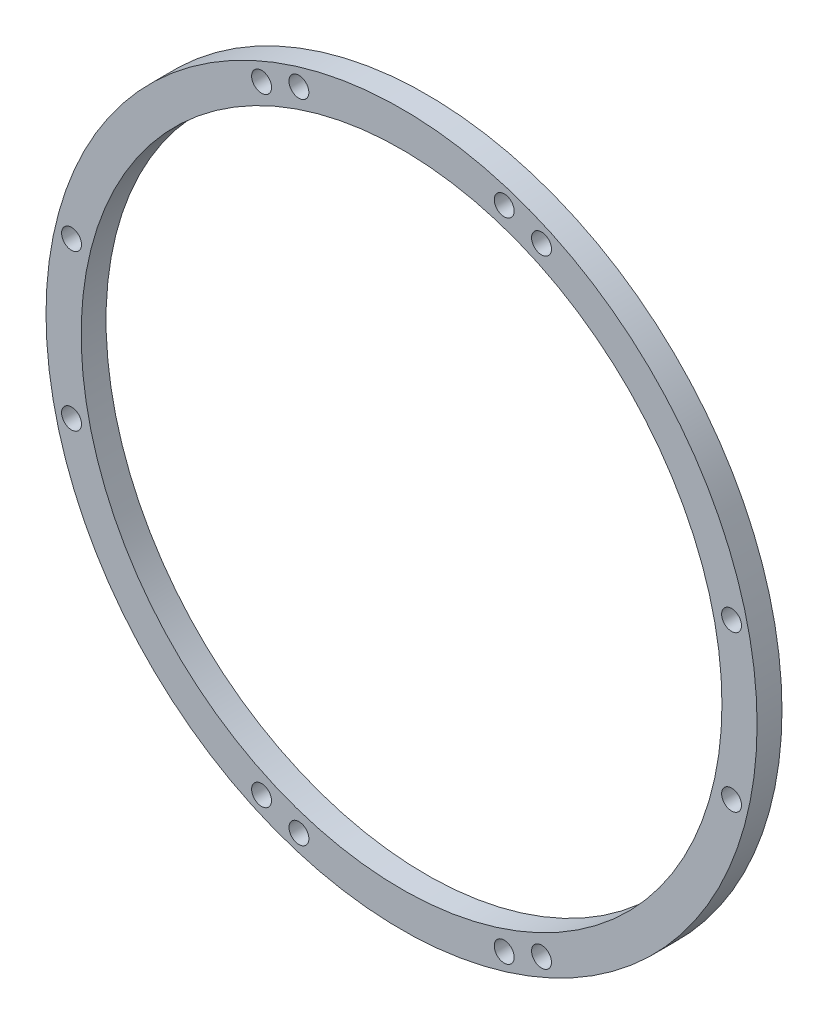
ISO-10303-21;
HEADER;
FILE_DESCRIPTION(('STEP AP214'),'2;1');
FILE_NAME('part.step','',(''),(''),'','','');
FILE_SCHEMA(('AUTOMOTIVE_DESIGN { 1 0 10303 214 1 1 1 1 }'));
ENDSEC;
DATA;
#1=APPLICATION_CONTEXT('core data for automotive mechanical design processes');
#2=APPLICATION_PROTOCOL_DEFINITION('international standard','automotive_design',2000,#1);
#3=PRODUCT_CONTEXT('',#1,'mechanical');
#4=PRODUCT('Part','Part','',(#3));
#5=PRODUCT_RELATED_PRODUCT_CATEGORY('part','',(#4));
#6=PRODUCT_DEFINITION_FORMATION('','',#4);
#7=PRODUCT_DEFINITION_CONTEXT('part definition',#1,'design');
#8=PRODUCT_DEFINITION('design','',#6,#7);
#9=PRODUCT_DEFINITION_SHAPE('','',#8);
#10=(LENGTH_UNIT() NAMED_UNIT(*) SI_UNIT(.MILLI.,.METRE.));
#11=(NAMED_UNIT(*) PLANE_ANGLE_UNIT() SI_UNIT($,.RADIAN.));
#12=(NAMED_UNIT(*) SI_UNIT($,.STERADIAN.) SOLID_ANGLE_UNIT());
#13=UNCERTAINTY_MEASURE_WITH_UNIT(LENGTH_MEASURE(1.E-05),#10,'distance_accuracy_value','');
#14=(GEOMETRIC_REPRESENTATION_CONTEXT(3) GLOBAL_UNCERTAINTY_ASSIGNED_CONTEXT((#13)) GLOBAL_UNIT_ASSIGNED_CONTEXT((#10,
#11,#12)) REPRESENTATION_CONTEXT('',''));
#15=CARTESIAN_POINT('',(0.,0.,0.));
#16=DIRECTION('',(0.,0.,1.));
#17=DIRECTION('',(1.,0.,0.));
#18=AXIS2_PLACEMENT_3D('',#15,#16,#17);
#19=CARTESIAN_POINT('',(0.,0.,4.));
#20=DIRECTION('',(0.,0.,1.));
#21=DIRECTION('',(1.,0.,0.));
#22=AXIS2_PLACEMENT_3D('',#19,#20,#21);
#23=PLANE('',#22);
#24=CARTESIAN_POINT('',(-22.5,49.6386945839634,4.));
#25=DIRECTION('',(0.,0.,1.));
#26=DIRECTION('',(-1.,0.,0.));
#27=AXIS2_PLACEMENT_3D('',#24,#25,#26);
#28=CIRCLE('',#27,1.6);
#29=CARTESIAN_POINT('',(-24.1,49.6386945839634,4.));
#30=VERTEX_POINT('',#29);
#31=EDGE_CURVE('E113',#30,#30,#28,.T.);
#32=ORIENTED_EDGE('',*,*,#31,.F.);
#33=EDGE_LOOP('',(#32));
#34=FACE_BOUND('',#33,.T.);
#35=CARTESIAN_POINT('',(-53.0471488394994,-12.5,4.));
#36=DIRECTION('',(0.,0.,1.));
#37=DIRECTION('',(1.,0.,0.));
#38=AXIS2_PLACEMENT_3D('',#35,#36,#37);
#39=CIRCLE('',#38,1.6);
#40=CARTESIAN_POINT('',(-51.4471488394994,-12.5,4.));
#41=VERTEX_POINT('',#40);
#42=EDGE_CURVE('E101',#41,#41,#39,.T.);
#43=ORIENTED_EDGE('',*,*,#42,.F.);
#44=EDGE_LOOP('',(#43));
#45=FACE_BOUND('',#44,.T.);
#46=CARTESIAN_POINT('',(-16.5,-51.9422756528822,4.));
#47=DIRECTION('',(0.,0.,1.));
#48=DIRECTION('',(1.,0.,0.));
#49=AXIS2_PLACEMENT_3D('',#46,#47,#48);
#50=CIRCLE('',#49,1.6);
#51=CARTESIAN_POINT('',(-14.9,-51.9422756528822,4.));
#52=VERTEX_POINT('',#51);
#53=EDGE_CURVE('E89',#52,#52,#50,.T.);
#54=ORIENTED_EDGE('',*,*,#53,.F.);
#55=EDGE_LOOP('',(#54));
#56=FACE_BOUND('',#55,.T.);
#57=CARTESIAN_POINT('',(16.5,-51.9422756528822,4.));
#58=DIRECTION('',(0.,0.,1.));
#59=DIRECTION('',(-1.,0.,0.));
#60=AXIS2_PLACEMENT_3D('',#57,#58,#59);
#61=CIRCLE('',#60,1.6);
#62=CARTESIAN_POINT('',(14.9,-51.9422756528822,4.));
#63=VERTEX_POINT('',#62);
#64=EDGE_CURVE('E77',#63,#63,#61,.T.);
#65=ORIENTED_EDGE('',*,*,#64,.F.);
#66=EDGE_LOOP('',(#65));
#67=FACE_BOUND('',#66,.T.);
#68=CARTESIAN_POINT('',(53.0471488394994,12.5,4.));
#69=DIRECTION('',(0.,0.,1.));
#70=DIRECTION('',(1.,0.,0.));
#71=AXIS2_PLACEMENT_3D('',#68,#69,#70);
#72=CIRCLE('',#71,1.6);
#73=CARTESIAN_POINT('',(54.6471488394994,12.5,4.));
#74=VERTEX_POINT('',#73);
#75=EDGE_CURVE('E65',#74,#74,#72,.T.);
#76=ORIENTED_EDGE('',*,*,#75,.F.);
#77=EDGE_LOOP('',(#76));
#78=FACE_BOUND('',#77,.T.);
#79=CARTESIAN_POINT('',(16.5,51.9422756528822,4.));
#80=DIRECTION('',(0.,0.,1.));
#81=DIRECTION('',(1.,0.,0.));
#82=AXIS2_PLACEMENT_3D('',#79,#80,#81);
#83=CIRCLE('',#82,1.6);
#84=CARTESIAN_POINT('',(18.1,51.9422756528822,4.));
#85=VERTEX_POINT('',#84);
#86=EDGE_CURVE('E53',#85,#85,#83,.T.);
#87=ORIENTED_EDGE('',*,*,#86,.F.);
#88=EDGE_LOOP('',(#87));
#89=FACE_BOUND('',#88,.T.);
#90=CARTESIAN_POINT('',(0.,0.,4.));
#91=DIRECTION('',(0.,0.,1.));
#92=DIRECTION('',(1.,0.,0.));
#93=AXIS2_PLACEMENT_3D('',#90,#91,#92);
#94=CIRCLE('',#93,57.15);
#95=CARTESIAN_POINT('',(57.15,0.,4.));
#96=VERTEX_POINT('',#95);
#97=EDGE_CURVE('E10',#96,#96,#94,.T.);
#98=ORIENTED_EDGE('',*,*,#97,.T.);
#99=EDGE_LOOP('',(#98));
#100=FACE_BOUND('',#99,.T.);
#101=CARTESIAN_POINT('',(0.,0.,4.));
#102=DIRECTION('',(0.,0.,1.));
#103=DIRECTION('',(1.,0.,0.));
#104=AXIS2_PLACEMENT_3D('',#101,#102,#103);
#105=CIRCLE('',#104,51.5);
#106=CARTESIAN_POINT('',(51.5,0.,4.));
#107=VERTEX_POINT('',#106);
#108=EDGE_CURVE('E48',#107,#107,#105,.T.);
#109=ORIENTED_EDGE('',*,*,#108,.F.);
#110=EDGE_LOOP('',(#109));
#111=FACE_BOUND('',#110,.T.);
#112=CARTESIAN_POINT('',(22.5,49.6386945839634,4.));
#113=DIRECTION('',(0.,0.,1.));
#114=DIRECTION('',(1.,0.,0.));
#115=AXIS2_PLACEMENT_3D('',#112,#113,#114);
#116=CIRCLE('',#115,1.6);
#117=CARTESIAN_POINT('',(24.1,49.6386945839634,4.));
#118=VERTEX_POINT('',#117);
#119=EDGE_CURVE('E59',#118,#118,#116,.T.);
#120=ORIENTED_EDGE('',*,*,#119,.F.);
#121=EDGE_LOOP('',(#120));
#122=FACE_BOUND('',#121,.T.);
#123=CARTESIAN_POINT('',(22.5,-49.6386945839634,4.));
#124=DIRECTION('',(0.,0.,1.));
#125=DIRECTION('',(-1.,0.,0.));
#126=AXIS2_PLACEMENT_3D('',#123,#124,#125);
#127=CIRCLE('',#126,1.6);
#128=CARTESIAN_POINT('',(20.9,-49.6386945839634,4.));
#129=VERTEX_POINT('',#128);
#130=EDGE_CURVE('E71',#129,#129,#127,.T.);
#131=ORIENTED_EDGE('',*,*,#130,.F.);
#132=EDGE_LOOP('',(#131));
#133=FACE_BOUND('',#132,.T.);
#134=CARTESIAN_POINT('',(53.0471488394994,-12.5,4.));
#135=DIRECTION('',(0.,0.,1.));
#136=DIRECTION('',(-1.,0.,0.));
#137=AXIS2_PLACEMENT_3D('',#134,#135,#136);
#138=CIRCLE('',#137,1.6);
#139=CARTESIAN_POINT('',(51.4471488394994,-12.5,4.));
#140=VERTEX_POINT('',#139);
#141=EDGE_CURVE('E83',#140,#140,#138,.T.);
#142=ORIENTED_EDGE('',*,*,#141,.F.);
#143=EDGE_LOOP('',(#142));
#144=FACE_BOUND('',#143,.T.);
#145=CARTESIAN_POINT('',(-22.5,-49.6386945839634,4.));
#146=DIRECTION('',(0.,0.,1.));
#147=DIRECTION('',(1.,0.,0.));
#148=AXIS2_PLACEMENT_3D('',#145,#146,#147);
#149=CIRCLE('',#148,1.6);
#150=CARTESIAN_POINT('',(-20.9,-49.6386945839634,4.));
#151=VERTEX_POINT('',#150);
#152=EDGE_CURVE('E95',#151,#151,#149,.T.);
#153=ORIENTED_EDGE('',*,*,#152,.F.);
#154=EDGE_LOOP('',(#153));
#155=FACE_BOUND('',#154,.T.);
#156=CARTESIAN_POINT('',(-53.0471488394994,12.5,4.));
#157=DIRECTION('',(0.,0.,1.));
#158=DIRECTION('',(-1.,0.,0.));
#159=AXIS2_PLACEMENT_3D('',#156,#157,#158);
#160=CIRCLE('',#159,1.6);
#161=CARTESIAN_POINT('',(-54.6471488394994,12.5,4.));
#162=VERTEX_POINT('',#161);
#163=EDGE_CURVE('E107',#162,#162,#160,.T.);
#164=ORIENTED_EDGE('',*,*,#163,.F.);
#165=EDGE_LOOP('',(#164));
#166=FACE_BOUND('',#165,.T.);
#167=CARTESIAN_POINT('',(-16.5,51.9422756528822,4.));
#168=DIRECTION('',(0.,0.,1.));
#169=DIRECTION('',(-1.,0.,0.));
#170=AXIS2_PLACEMENT_3D('',#167,#168,#169);
#171=CIRCLE('',#170,1.6);
#172=CARTESIAN_POINT('',(-18.1,51.9422756528822,4.));
#173=VERTEX_POINT('',#172);
#174=EDGE_CURVE('E119',#173,#173,#171,.T.);
#175=ORIENTED_EDGE('',*,*,#174,.F.);
#176=EDGE_LOOP('',(#175));
#177=FACE_BOUND('',#176,.T.);
#178=ADVANCED_FACE('F37',(#34,#45,#56,#67,#78,#89,#100,#111,#122,#133,#144,#155,#166,#177),#23,.T.);
#179=CARTESIAN_POINT('',(0.,0.,0.));
#180=DIRECTION('',(0.,0.,1.));
#181=DIRECTION('',(1.,0.,0.));
#182=AXIS2_PLACEMENT_3D('',#179,#180,#181);
#183=PLANE('',#182);
#184=CARTESIAN_POINT('',(0.,0.,0.));
#185=DIRECTION('',(0.,0.,1.));
#186=DIRECTION('',(1.,0.,0.));
#187=AXIS2_PLACEMENT_3D('',#184,#185,#186);
#188=CIRCLE('',#187,57.15);
#189=CARTESIAN_POINT('',(57.15,0.,0.));
#190=VERTEX_POINT('',#189);
#191=EDGE_CURVE('E41',#190,#190,#188,.T.);
#192=ORIENTED_EDGE('',*,*,#191,.F.);
#193=EDGE_LOOP('',(#192));
#194=FACE_BOUND('',#193,.T.);
#195=CARTESIAN_POINT('',(0.,0.,0.));
#196=DIRECTION('',(0.,0.,1.));
#197=DIRECTION('',(1.,0.,0.));
#198=AXIS2_PLACEMENT_3D('',#195,#196,#197);
#199=CIRCLE('',#198,51.5);
#200=CARTESIAN_POINT('',(51.5,0.,0.));
#201=VERTEX_POINT('',#200);
#202=EDGE_CURVE('E50',#201,#201,#199,.T.);
#203=ORIENTED_EDGE('',*,*,#202,.T.);
#204=EDGE_LOOP('',(#203));
#205=FACE_BOUND('',#204,.T.);
#206=CARTESIAN_POINT('',(16.5,51.9422756528822,0.));
#207=DIRECTION('',(0.,0.,1.));
#208=DIRECTION('',(1.,0.,0.));
#209=AXIS2_PLACEMENT_3D('',#206,#207,#208);
#210=CIRCLE('',#209,1.6);
#211=CARTESIAN_POINT('',(18.1,51.9422756528822,0.));
#212=VERTEX_POINT('',#211);
#213=EDGE_CURVE('E56',#212,#212,#210,.T.);
#214=ORIENTED_EDGE('',*,*,#213,.T.);
#215=EDGE_LOOP('',(#214));
#216=FACE_BOUND('',#215,.T.);
#217=CARTESIAN_POINT('',(22.5,49.6386945839634,0.));
#218=DIRECTION('',(0.,0.,1.));
#219=DIRECTION('',(1.,0.,0.));
#220=AXIS2_PLACEMENT_3D('',#217,#218,#219);
#221=CIRCLE('',#220,1.6);
#222=CARTESIAN_POINT('',(24.1,49.6386945839634,0.));
#223=VERTEX_POINT('',#222);
#224=EDGE_CURVE('E62',#223,#223,#221,.T.);
#225=ORIENTED_EDGE('',*,*,#224,.T.);
#226=EDGE_LOOP('',(#225));
#227=FACE_BOUND('',#226,.T.);
#228=CARTESIAN_POINT('',(53.0471488394994,12.5,0.));
#229=DIRECTION('',(0.,0.,1.));
#230=DIRECTION('',(1.,0.,0.));
#231=AXIS2_PLACEMENT_3D('',#228,#229,#230);
#232=CIRCLE('',#231,1.6);
#233=CARTESIAN_POINT('',(54.6471488394994,12.5,0.));
#234=VERTEX_POINT('',#233);
#235=EDGE_CURVE('E68',#234,#234,#232,.T.);
#236=ORIENTED_EDGE('',*,*,#235,.T.);
#237=EDGE_LOOP('',(#236));
#238=FACE_BOUND('',#237,.T.);
#239=CARTESIAN_POINT('',(22.5,-49.6386945839634,0.));
#240=DIRECTION('',(0.,0.,1.));
#241=DIRECTION('',(-1.,0.,0.));
#242=AXIS2_PLACEMENT_3D('',#239,#240,#241);
#243=CIRCLE('',#242,1.6);
#244=CARTESIAN_POINT('',(20.9,-49.6386945839634,0.));
#245=VERTEX_POINT('',#244);
#246=EDGE_CURVE('E74',#245,#245,#243,.T.);
#247=ORIENTED_EDGE('',*,*,#246,.T.);
#248=EDGE_LOOP('',(#247));
#249=FACE_BOUND('',#248,.T.);
#250=CARTESIAN_POINT('',(16.5,-51.9422756528822,0.));
#251=DIRECTION('',(0.,0.,1.));
#252=DIRECTION('',(-1.,0.,0.));
#253=AXIS2_PLACEMENT_3D('',#250,#251,#252);
#254=CIRCLE('',#253,1.6);
#255=CARTESIAN_POINT('',(14.9,-51.9422756528822,0.));
#256=VERTEX_POINT('',#255);
#257=EDGE_CURVE('E80',#256,#256,#254,.T.);
#258=ORIENTED_EDGE('',*,*,#257,.T.);
#259=EDGE_LOOP('',(#258));
#260=FACE_BOUND('',#259,.T.);
#261=CARTESIAN_POINT('',(53.0471488394994,-12.5,0.));
#262=DIRECTION('',(0.,0.,1.));
#263=DIRECTION('',(-1.,0.,0.));
#264=AXIS2_PLACEMENT_3D('',#261,#262,#263);
#265=CIRCLE('',#264,1.6);
#266=CARTESIAN_POINT('',(51.4471488394994,-12.5,0.));
#267=VERTEX_POINT('',#266);
#268=EDGE_CURVE('E86',#267,#267,#265,.T.);
#269=ORIENTED_EDGE('',*,*,#268,.T.);
#270=EDGE_LOOP('',(#269));
#271=FACE_BOUND('',#270,.T.);
#272=CARTESIAN_POINT('',(-16.5,-51.9422756528822,0.));
#273=DIRECTION('',(0.,0.,1.));
#274=DIRECTION('',(1.,0.,0.));
#275=AXIS2_PLACEMENT_3D('',#272,#273,#274);
#276=CIRCLE('',#275,1.6);
#277=CARTESIAN_POINT('',(-14.9,-51.9422756528822,0.));
#278=VERTEX_POINT('',#277);
#279=EDGE_CURVE('E92',#278,#278,#276,.T.);
#280=ORIENTED_EDGE('',*,*,#279,.T.);
#281=EDGE_LOOP('',(#280));
#282=FACE_BOUND('',#281,.T.);
#283=CARTESIAN_POINT('',(-22.5,-49.6386945839634,0.));
#284=DIRECTION('',(0.,0.,1.));
#285=DIRECTION('',(1.,0.,0.));
#286=AXIS2_PLACEMENT_3D('',#283,#284,#285);
#287=CIRCLE('',#286,1.6);
#288=CARTESIAN_POINT('',(-20.9,-49.6386945839634,0.));
#289=VERTEX_POINT('',#288);
#290=EDGE_CURVE('E98',#289,#289,#287,.T.);
#291=ORIENTED_EDGE('',*,*,#290,.T.);
#292=EDGE_LOOP('',(#291));
#293=FACE_BOUND('',#292,.T.);
#294=CARTESIAN_POINT('',(-53.0471488394994,-12.5,0.));
#295=DIRECTION('',(0.,0.,1.));
#296=DIRECTION('',(1.,0.,0.));
#297=AXIS2_PLACEMENT_3D('',#294,#295,#296);
#298=CIRCLE('',#297,1.6);
#299=CARTESIAN_POINT('',(-51.4471488394994,-12.5,0.));
#300=VERTEX_POINT('',#299);
#301=EDGE_CURVE('E104',#300,#300,#298,.T.);
#302=ORIENTED_EDGE('',*,*,#301,.T.);
#303=EDGE_LOOP('',(#302));
#304=FACE_BOUND('',#303,.T.);
#305=CARTESIAN_POINT('',(-53.0471488394994,12.5,0.));
#306=DIRECTION('',(0.,0.,1.));
#307=DIRECTION('',(-1.,0.,0.));
#308=AXIS2_PLACEMENT_3D('',#305,#306,#307);
#309=CIRCLE('',#308,1.6);
#310=CARTESIAN_POINT('',(-54.6471488394994,12.5,0.));
#311=VERTEX_POINT('',#310);
#312=EDGE_CURVE('E110',#311,#311,#309,.T.);
#313=ORIENTED_EDGE('',*,*,#312,.T.);
#314=EDGE_LOOP('',(#313));
#315=FACE_BOUND('',#314,.T.);
#316=CARTESIAN_POINT('',(-22.5,49.6386945839634,0.));
#317=DIRECTION('',(0.,0.,1.));
#318=DIRECTION('',(-1.,0.,0.));
#319=AXIS2_PLACEMENT_3D('',#316,#317,#318);
#320=CIRCLE('',#319,1.6);
#321=CARTESIAN_POINT('',(-24.1,49.6386945839634,0.));
#322=VERTEX_POINT('',#321);
#323=EDGE_CURVE('E116',#322,#322,#320,.T.);
#324=ORIENTED_EDGE('',*,*,#323,.T.);
#325=EDGE_LOOP('',(#324));
#326=FACE_BOUND('',#325,.T.);
#327=CARTESIAN_POINT('',(-16.5,51.9422756528822,0.));
#328=DIRECTION('',(0.,0.,1.));
#329=DIRECTION('',(-1.,0.,0.));
#330=AXIS2_PLACEMENT_3D('',#327,#328,#329);
#331=CIRCLE('',#330,1.6);
#332=CARTESIAN_POINT('',(-18.1,51.9422756528822,0.));
#333=VERTEX_POINT('',#332);
#334=EDGE_CURVE('E122',#333,#333,#331,.T.);
#335=ORIENTED_EDGE('',*,*,#334,.T.);
#336=EDGE_LOOP('',(#335));
#337=FACE_BOUND('',#336,.T.);
#338=ADVANCED_FACE('F132',(#194,#205,#216,#227,#238,#249,#260,#271,#282,#293,#304,#315,#326,
#337),#183,.F.);
#339=CARTESIAN_POINT('',(0.,0.,4.));
#340=DIRECTION('',(0.,0.,-1.));
#341=DIRECTION('',(-1.,0.,0.));
#342=AXIS2_PLACEMENT_3D('',#339,#340,#341);
#343=CYLINDRICAL_SURFACE('',#342,57.15);
#344=ORIENTED_EDGE('',*,*,#97,.F.);
#345=EDGE_LOOP('',(#344));
#346=FACE_BOUND('',#345,.T.);
#347=ORIENTED_EDGE('',*,*,#191,.T.);
#348=EDGE_LOOP('',(#347));
#349=FACE_BOUND('',#348,.T.);
#350=ADVANCED_FACE('F39',(#346,#349),#343,.T.);
#351=CARTESIAN_POINT('',(0.,0.,4.));
#352=DIRECTION('',(0.,0.,-1.));
#353=DIRECTION('',(-1.,0.,0.));
#354=AXIS2_PLACEMENT_3D('',#351,#352,#353);
#355=CYLINDRICAL_SURFACE('',#354,51.5);
#356=ORIENTED_EDGE('',*,*,#108,.T.);
#357=EDGE_LOOP('',(#356));
#358=FACE_BOUND('',#357,.T.);
#359=ORIENTED_EDGE('',*,*,#202,.F.);
#360=EDGE_LOOP('',(#359));
#361=FACE_BOUND('',#360,.T.);
#362=ADVANCED_FACE('F142',(#358,#361),#355,.F.);
#363=CARTESIAN_POINT('',(16.5,51.9422756528822,4.));
#364=DIRECTION('',(0.,0.,-1.));
#365=DIRECTION('',(-1.,0.,0.));
#366=AXIS2_PLACEMENT_3D('',#363,#364,#365);
#367=CYLINDRICAL_SURFACE('',#366,1.6);
#368=ORIENTED_EDGE('',*,*,#86,.T.);
#369=EDGE_LOOP('',(#368));
#370=FACE_BOUND('',#369,.T.);
#371=ORIENTED_EDGE('',*,*,#213,.F.);
#372=EDGE_LOOP('',(#371));
#373=FACE_BOUND('',#372,.T.);
#374=ADVANCED_FACE('F145',(#370,#373),#367,.F.);
#375=CARTESIAN_POINT('',(22.5,49.6386945839634,4.));
#376=DIRECTION('',(0.,0.,-1.));
#377=DIRECTION('',(-1.,0.,0.));
#378=AXIS2_PLACEMENT_3D('',#375,#376,#377);
#379=CYLINDRICAL_SURFACE('',#378,1.6);
#380=ORIENTED_EDGE('',*,*,#119,.T.);
#381=EDGE_LOOP('',(#380));
#382=FACE_BOUND('',#381,.T.);
#383=ORIENTED_EDGE('',*,*,#224,.F.);
#384=EDGE_LOOP('',(#383));
#385=FACE_BOUND('',#384,.T.);
#386=ADVANCED_FACE('F149',(#382,#385),#379,.F.);
#387=CARTESIAN_POINT('',(53.0471488394994,12.5,4.));
#388=DIRECTION('',(0.,0.,-1.));
#389=DIRECTION('',(-1.,0.,0.));
#390=AXIS2_PLACEMENT_3D('',#387,#388,#389);
#391=CYLINDRICAL_SURFACE('',#390,1.6);
#392=ORIENTED_EDGE('',*,*,#75,.T.);
#393=EDGE_LOOP('',(#392));
#394=FACE_BOUND('',#393,.T.);
#395=ORIENTED_EDGE('',*,*,#235,.F.);
#396=EDGE_LOOP('',(#395));
#397=FACE_BOUND('',#396,.T.);
#398=ADVANCED_FACE('F153',(#394,#397),#391,.F.);
#399=CARTESIAN_POINT('',(22.5,-49.6386945839634,4.));
#400=DIRECTION('',(0.,0.,-1.));
#401=DIRECTION('',(-1.,0.,0.));
#402=AXIS2_PLACEMENT_3D('',#399,#400,#401);
#403=CYLINDRICAL_SURFACE('',#402,1.6);
#404=ORIENTED_EDGE('',*,*,#130,.T.);
#405=EDGE_LOOP('',(#404));
#406=FACE_BOUND('',#405,.T.);
#407=ORIENTED_EDGE('',*,*,#246,.F.);
#408=EDGE_LOOP('',(#407));
#409=FACE_BOUND('',#408,.T.);
#410=ADVANCED_FACE('F157',(#406,#409),#403,.F.);
#411=CARTESIAN_POINT('',(16.5,-51.9422756528822,4.));
#412=DIRECTION('',(0.,0.,-1.));
#413=DIRECTION('',(-1.,0.,0.));
#414=AXIS2_PLACEMENT_3D('',#411,#412,#413);
#415=CYLINDRICAL_SURFACE('',#414,1.6);
#416=ORIENTED_EDGE('',*,*,#64,.T.);
#417=EDGE_LOOP('',(#416));
#418=FACE_BOUND('',#417,.T.);
#419=ORIENTED_EDGE('',*,*,#257,.F.);
#420=EDGE_LOOP('',(#419));
#421=FACE_BOUND('',#420,.T.);
#422=ADVANCED_FACE('F161',(#418,#421),#415,.F.);
#423=CARTESIAN_POINT('',(53.0471488394994,-12.5,4.));
#424=DIRECTION('',(0.,0.,-1.));
#425=DIRECTION('',(-1.,0.,0.));
#426=AXIS2_PLACEMENT_3D('',#423,#424,#425);
#427=CYLINDRICAL_SURFACE('',#426,1.6);
#428=ORIENTED_EDGE('',*,*,#141,.T.);
#429=EDGE_LOOP('',(#428));
#430=FACE_BOUND('',#429,.T.);
#431=ORIENTED_EDGE('',*,*,#268,.F.);
#432=EDGE_LOOP('',(#431));
#433=FACE_BOUND('',#432,.T.);
#434=ADVANCED_FACE('F165',(#430,#433),#427,.F.);
#435=CARTESIAN_POINT('',(-16.5,-51.9422756528822,4.));
#436=DIRECTION('',(0.,0.,-1.));
#437=DIRECTION('',(-1.,0.,0.));
#438=AXIS2_PLACEMENT_3D('',#435,#436,#437);
#439=CYLINDRICAL_SURFACE('',#438,1.6);
#440=ORIENTED_EDGE('',*,*,#53,.T.);
#441=EDGE_LOOP('',(#440));
#442=FACE_BOUND('',#441,.T.);
#443=ORIENTED_EDGE('',*,*,#279,.F.);
#444=EDGE_LOOP('',(#443));
#445=FACE_BOUND('',#444,.T.);
#446=ADVANCED_FACE('F169',(#442,#445),#439,.F.);
#447=CARTESIAN_POINT('',(-22.5,-49.6386945839634,4.));
#448=DIRECTION('',(0.,0.,-1.));
#449=DIRECTION('',(-1.,0.,0.));
#450=AXIS2_PLACEMENT_3D('',#447,#448,#449);
#451=CYLINDRICAL_SURFACE('',#450,1.6);
#452=ORIENTED_EDGE('',*,*,#152,.T.);
#453=EDGE_LOOP('',(#452));
#454=FACE_BOUND('',#453,.T.);
#455=ORIENTED_EDGE('',*,*,#290,.F.);
#456=EDGE_LOOP('',(#455));
#457=FACE_BOUND('',#456,.T.);
#458=ADVANCED_FACE('F173',(#454,#457),#451,.F.);
#459=CARTESIAN_POINT('',(-53.0471488394994,-12.5,4.));
#460=DIRECTION('',(0.,0.,-1.));
#461=DIRECTION('',(-1.,0.,0.));
#462=AXIS2_PLACEMENT_3D('',#459,#460,#461);
#463=CYLINDRICAL_SURFACE('',#462,1.6);
#464=ORIENTED_EDGE('',*,*,#42,.T.);
#465=EDGE_LOOP('',(#464));
#466=FACE_BOUND('',#465,.T.);
#467=ORIENTED_EDGE('',*,*,#301,.F.);
#468=EDGE_LOOP('',(#467));
#469=FACE_BOUND('',#468,.T.);
#470=ADVANCED_FACE('F177',(#466,#469),#463,.F.);
#471=CARTESIAN_POINT('',(-53.0471488394994,12.5,4.));
#472=DIRECTION('',(0.,0.,-1.));
#473=DIRECTION('',(-1.,0.,0.));
#474=AXIS2_PLACEMENT_3D('',#471,#472,#473);
#475=CYLINDRICAL_SURFACE('',#474,1.6);
#476=ORIENTED_EDGE('',*,*,#163,.T.);
#477=EDGE_LOOP('',(#476));
#478=FACE_BOUND('',#477,.T.);
#479=ORIENTED_EDGE('',*,*,#312,.F.);
#480=EDGE_LOOP('',(#479));
#481=FACE_BOUND('',#480,.T.);
#482=ADVANCED_FACE('F181',(#478,#481),#475,.F.);
#483=CARTESIAN_POINT('',(-22.5,49.6386945839634,4.));
#484=DIRECTION('',(0.,0.,-1.));
#485=DIRECTION('',(-1.,0.,0.));
#486=AXIS2_PLACEMENT_3D('',#483,#484,#485);
#487=CYLINDRICAL_SURFACE('',#486,1.6);
#488=ORIENTED_EDGE('',*,*,#31,.T.);
#489=EDGE_LOOP('',(#488));
#490=FACE_BOUND('',#489,.T.);
#491=ORIENTED_EDGE('',*,*,#323,.F.);
#492=EDGE_LOOP('',(#491));
#493=FACE_BOUND('',#492,.T.);
#494=ADVANCED_FACE('F185',(#490,#493),#487,.F.);
#495=CARTESIAN_POINT('',(-16.5,51.9422756528822,4.));
#496=DIRECTION('',(0.,0.,-1.));
#497=DIRECTION('',(-1.,0.,0.));
#498=AXIS2_PLACEMENT_3D('',#495,#496,#497);
#499=CYLINDRICAL_SURFACE('',#498,1.6);
#500=ORIENTED_EDGE('',*,*,#174,.T.);
#501=EDGE_LOOP('',(#500));
#502=FACE_BOUND('',#501,.T.);
#503=ORIENTED_EDGE('',*,*,#334,.F.);
#504=EDGE_LOOP('',(#503));
#505=FACE_BOUND('',#504,.T.);
#506=ADVANCED_FACE('F128',(#502,#505),#499,.F.);
#507=CLOSED_SHELL('',(#178,#338,#350,#362,#374,#386,#398,#410,#422,#434,#446,#458,#470,#482,
#494,#506));
#508=MANIFOLD_SOLID_BREP('B2',#507);
#509=ADVANCED_BREP_SHAPE_REPRESENTATION('',(#18,#508),#14);
#510=SHAPE_DEFINITION_REPRESENTATION(#9,#509);
ENDSEC;
END-ISO-10303-21;
